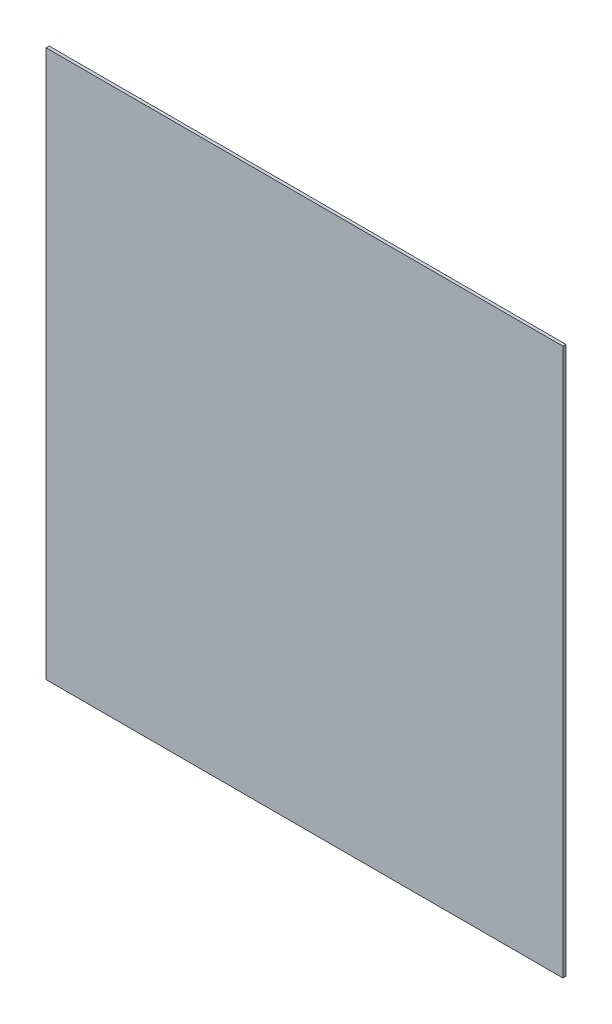
ISO-10303-21;
HEADER;
FILE_DESCRIPTION(('STEP AP214'),'2;1');
FILE_NAME('part.step','',(''),(''),'','','');
FILE_SCHEMA(('AUTOMOTIVE_DESIGN { 1 0 10303 214 1 1 1 1 }'));
ENDSEC;
DATA;
#1=APPLICATION_CONTEXT('core data for automotive mechanical design processes');
#2=APPLICATION_PROTOCOL_DEFINITION('international standard','automotive_design',2000,#1);
#3=PRODUCT_CONTEXT('',#1,'mechanical');
#4=PRODUCT('Part','Part','',(#3));
#5=PRODUCT_RELATED_PRODUCT_CATEGORY('part','',(#4));
#6=PRODUCT_DEFINITION_FORMATION('','',#4);
#7=PRODUCT_DEFINITION_CONTEXT('part definition',#1,'design');
#8=PRODUCT_DEFINITION('design','',#6,#7);
#9=PRODUCT_DEFINITION_SHAPE('','',#8);
#10=(LENGTH_UNIT() NAMED_UNIT(*) SI_UNIT(.MILLI.,.METRE.));
#11=(NAMED_UNIT(*) PLANE_ANGLE_UNIT() SI_UNIT($,.RADIAN.));
#12=(NAMED_UNIT(*) SI_UNIT($,.STERADIAN.) SOLID_ANGLE_UNIT());
#13=UNCERTAINTY_MEASURE_WITH_UNIT(LENGTH_MEASURE(1.E-05),#10,'distance_accuracy_value','');
#14=(GEOMETRIC_REPRESENTATION_CONTEXT(3) GLOBAL_UNCERTAINTY_ASSIGNED_CONTEXT((#13)) GLOBAL_UNIT_ASSIGNED_CONTEXT((#10,
#11,#12)) REPRESENTATION_CONTEXT('',''));
#15=CARTESIAN_POINT('',(0.,0.,0.));
#16=DIRECTION('',(0.,0.,1.));
#17=DIRECTION('',(1.,0.,0.));
#18=AXIS2_PLACEMENT_3D('',#15,#16,#17);
#19=CARTESIAN_POINT('',(-255.,270.,3.));
#20=DIRECTION('',(1.,0.,0.));
#21=DIRECTION('',(0.,1.,0.));
#22=AXIS2_PLACEMENT_3D('',#19,#20,#21);
#23=PLANE('',#22);
#24=DIRECTION('',(0.,-1.,0.));
#25=VECTOR('',#24,1.);
#26=CARTESIAN_POINT('',(-255.,270.,0.));
#27=LINE('',#26,#25);
#28=CARTESIAN_POINT('',(-255.,270.,0.));
#29=VERTEX_POINT('',#28);
#30=CARTESIAN_POINT('',(-255.,-270.,0.));
#31=VERTEX_POINT('',#30);
#32=EDGE_CURVE('E100',#29,#31,#27,.T.);
#33=ORIENTED_EDGE('',*,*,#32,.T.);
#34=DIRECTION('',(0.,0.,-1.));
#35=VECTOR('',#34,1.);
#36=CARTESIAN_POINT('',(-255.,-270.,3.));
#37=LINE('',#36,#35);
#38=CARTESIAN_POINT('',(-255.,-270.,3.));
#39=VERTEX_POINT('',#38);
#40=EDGE_CURVE('E11',#39,#31,#37,.T.);
#41=ORIENTED_EDGE('',*,*,#40,.F.);
#42=DIRECTION('',(0.,-1.,0.));
#43=VECTOR('',#42,1.);
#44=CARTESIAN_POINT('',(-255.,270.,3.));
#45=LINE('',#44,#43);
#46=CARTESIAN_POINT('',(-255.,270.,3.));
#47=VERTEX_POINT('',#46);
#48=EDGE_CURVE('E88',#47,#39,#45,.T.);
#49=ORIENTED_EDGE('',*,*,#48,.F.);
#50=DIRECTION('',(0.,0.,-1.));
#51=VECTOR('',#50,1.);
#52=CARTESIAN_POINT('',(-255.,270.,3.));
#53=LINE('',#52,#51);
#54=EDGE_CURVE('E96',#47,#29,#53,.T.);
#55=ORIENTED_EDGE('',*,*,#54,.T.);
#56=EDGE_LOOP('',(#33,#41,#49,#55));
#57=FACE_BOUND('',#56,.T.);
#58=ADVANCED_FACE('F37',(#57),#23,.F.);
#59=CARTESIAN_POINT('',(255.,-270.,3.));
#60=DIRECTION('',(0.,1.,0.));
#61=DIRECTION('',(-1.,0.,0.));
#62=AXIS2_PLACEMENT_3D('',#59,#60,#61);
#63=PLANE('',#62);
#64=DIRECTION('',(1.,0.,0.));
#65=VECTOR('',#64,1.);
#66=CARTESIAN_POINT('',(255.,-270.,0.));
#67=LINE('',#66,#65);
#68=CARTESIAN_POINT('',(255.,-270.,0.));
#69=VERTEX_POINT('',#68);
#70=EDGE_CURVE('E92',#31,#69,#67,.T.);
#71=ORIENTED_EDGE('',*,*,#70,.T.);
#72=DIRECTION('',(0.,0.,-1.));
#73=VECTOR('',#72,1.);
#74=CARTESIAN_POINT('',(255.,-270.,3.));
#75=LINE('',#74,#73);
#76=CARTESIAN_POINT('',(255.,-270.,3.));
#77=VERTEX_POINT('',#76);
#78=EDGE_CURVE('E45',#77,#69,#75,.T.);
#79=ORIENTED_EDGE('',*,*,#78,.F.);
#80=DIRECTION('',(1.,0.,0.));
#81=VECTOR('',#80,1.);
#82=CARTESIAN_POINT('',(255.,-270.,3.));
#83=LINE('',#82,#81);
#84=EDGE_CURVE('E83',#39,#77,#83,.T.);
#85=ORIENTED_EDGE('',*,*,#84,.F.);
#86=ORIENTED_EDGE('',*,*,#40,.T.);
#87=EDGE_LOOP('',(#71,#79,#85,#86));
#88=FACE_BOUND('',#87,.T.);
#89=ADVANCED_FACE('F91',(#88),#63,.F.);
#90=CARTESIAN_POINT('',(255.,270.,3.));
#91=DIRECTION('',(-1.,0.,0.));
#92=DIRECTION('',(0.,-1.,0.));
#93=AXIS2_PLACEMENT_3D('',#90,#91,#92);
#94=PLANE('',#93);
#95=DIRECTION('',(0.,1.,0.));
#96=VECTOR('',#95,1.);
#97=CARTESIAN_POINT('',(255.,270.,0.));
#98=LINE('',#97,#96);
#99=CARTESIAN_POINT('',(255.,270.,0.));
#100=VERTEX_POINT('',#99);
#101=EDGE_CURVE('E70',#69,#100,#98,.T.);
#102=ORIENTED_EDGE('',*,*,#101,.T.);
#103=DIRECTION('',(0.,0.,-1.));
#104=VECTOR('',#103,1.);
#105=CARTESIAN_POINT('',(255.,270.,3.));
#106=LINE('',#105,#104);
#107=CARTESIAN_POINT('',(255.,270.,3.));
#108=VERTEX_POINT('',#107);
#109=EDGE_CURVE('E93',#108,#100,#106,.T.);
#110=ORIENTED_EDGE('',*,*,#109,.F.);
#111=DIRECTION('',(0.,1.,0.));
#112=VECTOR('',#111,1.);
#113=CARTESIAN_POINT('',(255.,270.,3.));
#114=LINE('',#113,#112);
#115=EDGE_CURVE('E86',#77,#108,#114,.T.);
#116=ORIENTED_EDGE('',*,*,#115,.F.);
#117=ORIENTED_EDGE('',*,*,#78,.T.);
#118=EDGE_LOOP('',(#102,#110,#116,#117));
#119=FACE_BOUND('',#118,.T.);
#120=ADVANCED_FACE('F94',(#119),#94,.F.);
#121=CARTESIAN_POINT('',(255.,270.,3.));
#122=DIRECTION('',(0.,-1.,0.));
#123=DIRECTION('',(1.,0.,0.));
#124=AXIS2_PLACEMENT_3D('',#121,#122,#123);
#125=PLANE('',#124);
#126=DIRECTION('',(-1.,0.,0.));
#127=VECTOR('',#126,1.);
#128=CARTESIAN_POINT('',(255.,270.,0.));
#129=LINE('',#128,#127);
#130=EDGE_CURVE('E76',#100,#29,#129,.T.);
#131=ORIENTED_EDGE('',*,*,#130,.T.);
#132=ORIENTED_EDGE('',*,*,#54,.F.);
#133=DIRECTION('',(-1.,0.,0.));
#134=VECTOR('',#133,1.);
#135=CARTESIAN_POINT('',(255.,270.,3.));
#136=LINE('',#135,#134);
#137=EDGE_CURVE('E53',#108,#47,#136,.T.);
#138=ORIENTED_EDGE('',*,*,#137,.F.);
#139=ORIENTED_EDGE('',*,*,#109,.T.);
#140=EDGE_LOOP('',(#131,#132,#138,#139));
#141=FACE_BOUND('',#140,.T.);
#142=ADVANCED_FACE('F107',(#141),#125,.F.);
#143=CARTESIAN_POINT('',(0.,0.,3.));
#144=DIRECTION('',(0.,0.,-1.));
#145=DIRECTION('',(-1.,0.,0.));
#146=AXIS2_PLACEMENT_3D('',#143,#144,#145);
#147=PLANE('',#146);
#148=ORIENTED_EDGE('',*,*,#48,.T.);
#149=ORIENTED_EDGE('',*,*,#84,.T.);
#150=ORIENTED_EDGE('',*,*,#115,.T.);
#151=ORIENTED_EDGE('',*,*,#137,.T.);
#152=EDGE_LOOP('',(#148,#149,#150,#151));
#153=FACE_BOUND('',#152,.T.);
#154=ADVANCED_FACE('F84',(#153),#147,.F.);
#155=CARTESIAN_POINT('',(0.,0.,0.));
#156=DIRECTION('',(0.,0.,-1.));
#157=DIRECTION('',(-1.,0.,0.));
#158=AXIS2_PLACEMENT_3D('',#155,#156,#157);
#159=PLANE('',#158);
#160=ORIENTED_EDGE('',*,*,#32,.F.);
#161=ORIENTED_EDGE('',*,*,#130,.F.);
#162=ORIENTED_EDGE('',*,*,#101,.F.);
#163=ORIENTED_EDGE('',*,*,#70,.F.);
#164=EDGE_LOOP('',(#160,#161,#162,#163));
#165=FACE_BOUND('',#164,.T.);
#166=ADVANCED_FACE('F110',(#165),#159,.T.);
#167=CLOSED_SHELL('',(#58,#89,#120,#142,#154,#166));
#168=MANIFOLD_SOLID_BREP('B2',#167);
#169=ADVANCED_BREP_SHAPE_REPRESENTATION('',(#18,#168),#14);
#170=SHAPE_DEFINITION_REPRESENTATION(#9,#169);
ENDSEC;
END-ISO-10303-21;
